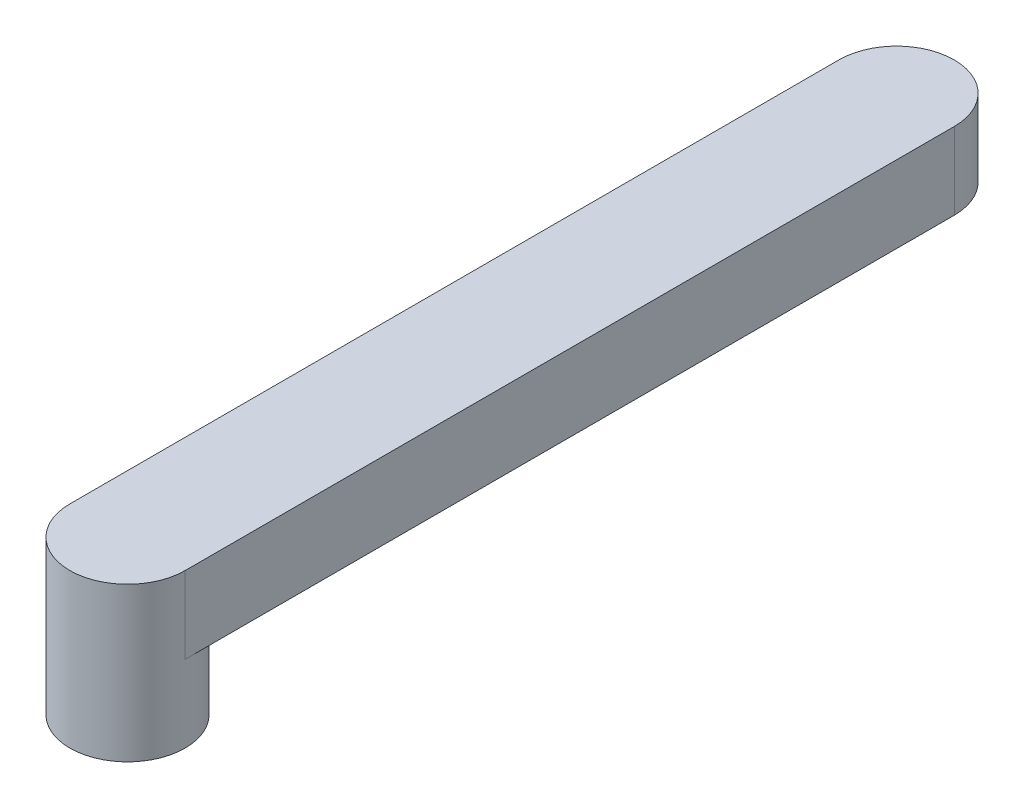
ISO-10303-21;
HEADER;
FILE_DESCRIPTION(('STEP AP214'),'2;1');
FILE_NAME('part.step','',(''),(''),'','','');
FILE_SCHEMA(('AUTOMOTIVE_DESIGN { 1 0 10303 214 1 1 1 1 }'));
ENDSEC;
DATA;
#1=APPLICATION_CONTEXT('core data for automotive mechanical design processes');
#2=APPLICATION_PROTOCOL_DEFINITION('international standard','automotive_design',2000,#1);
#3=PRODUCT_CONTEXT('',#1,'mechanical');
#4=PRODUCT('Part','Part','',(#3));
#5=PRODUCT_RELATED_PRODUCT_CATEGORY('part','',(#4));
#6=PRODUCT_DEFINITION_FORMATION('','',#4);
#7=PRODUCT_DEFINITION_CONTEXT('part definition',#1,'design');
#8=PRODUCT_DEFINITION('design','',#6,#7);
#9=PRODUCT_DEFINITION_SHAPE('','',#8);
#10=(LENGTH_UNIT() NAMED_UNIT(*) SI_UNIT(.MILLI.,.METRE.));
#11=(NAMED_UNIT(*) PLANE_ANGLE_UNIT() SI_UNIT($,.RADIAN.));
#12=(NAMED_UNIT(*) SI_UNIT($,.STERADIAN.) SOLID_ANGLE_UNIT());
#13=UNCERTAINTY_MEASURE_WITH_UNIT(LENGTH_MEASURE(1.E-05),#10,'distance_accuracy_value','');
#14=(GEOMETRIC_REPRESENTATION_CONTEXT(3) GLOBAL_UNCERTAINTY_ASSIGNED_CONTEXT((#13)) GLOBAL_UNIT_ASSIGNED_CONTEXT((#10,
#11,#12)) REPRESENTATION_CONTEXT('',''));
#15=CARTESIAN_POINT('',(0.,0.,0.));
#16=DIRECTION('',(0.,0.,1.));
#17=DIRECTION('',(1.,0.,0.));
#18=AXIS2_PLACEMENT_3D('',#15,#16,#17);
#19=CARTESIAN_POINT('',(1.905,2.54,0.));
#20=DIRECTION('',(-1.,0.,0.));
#21=DIRECTION('',(0.,0.,1.));
#22=AXIS2_PLACEMENT_3D('',#19,#20,#21);
#23=PLANE('',#22);
#24=DIRECTION('',(0.,0.,-1.));
#25=VECTOR('',#24,1.);
#26=CARTESIAN_POINT('',(1.905,0.,0.));
#27=LINE('',#26,#25);
#28=CARTESIAN_POINT('',(1.905,0.,15.24));
#29=VERTEX_POINT('',#28);
#30=CARTESIAN_POINT('',(1.905,0.,-10.16));
#31=VERTEX_POINT('',#30);
#32=EDGE_CURVE('E94',#29,#31,#27,.T.);
#33=ORIENTED_EDGE('',*,*,#32,.T.);
#34=DIRECTION('',(0.,-1.,0.));
#35=VECTOR('',#34,1.);
#36=CARTESIAN_POINT('',(1.905,2.54,-10.16));
#37=LINE('',#36,#35);
#38=CARTESIAN_POINT('',(1.905,2.54,-10.16));
#39=VERTEX_POINT('',#38);
#40=EDGE_CURVE('E11',#39,#31,#37,.T.);
#41=ORIENTED_EDGE('',*,*,#40,.F.);
#42=DIRECTION('',(0.,0.,-1.));
#43=VECTOR('',#42,1.);
#44=CARTESIAN_POINT('',(1.905,2.54,0.));
#45=LINE('',#44,#43);
#46=CARTESIAN_POINT('',(1.905,2.54,15.24));
#47=VERTEX_POINT('',#46);
#48=EDGE_CURVE('E95',#47,#39,#45,.T.);
#49=ORIENTED_EDGE('',*,*,#48,.F.);
#50=DIRECTION('',(0.,-1.,0.));
#51=VECTOR('',#50,1.);
#52=CARTESIAN_POINT('',(1.905,2.54,15.24));
#53=LINE('',#52,#51);
#54=EDGE_CURVE('E83',#47,#29,#53,.T.);
#55=ORIENTED_EDGE('',*,*,#54,.T.);
#56=EDGE_LOOP('',(#33,#41,#49,#55));
#57=FACE_BOUND('',#56,.T.);
#58=ADVANCED_FACE('F39',(#57),#23,.F.);
#59=CARTESIAN_POINT('',(0.,2.54,-10.16));
#60=DIRECTION('',(0.,-1.,0.));
#61=DIRECTION('',(0.,0.,-1.));
#62=AXIS2_PLACEMENT_3D('',#59,#60,#61);
#63=CYLINDRICAL_SURFACE('',#62,1.905);
#64=CARTESIAN_POINT('',(0.,0.,-10.16));
#65=DIRECTION('',(0.,1.,0.));
#66=DIRECTION('',(0.,0.,1.));
#67=AXIS2_PLACEMENT_3D('',#64,#65,#66);
#68=CIRCLE('',#67,1.905);
#69=CARTESIAN_POINT('',(-1.905,0.,-10.16));
#70=VERTEX_POINT('',#69);
#71=EDGE_CURVE('E89',#31,#70,#68,.T.);
#72=ORIENTED_EDGE('',*,*,#71,.T.);
#73=DIRECTION('',(0.,-1.,0.));
#74=VECTOR('',#73,1.);
#75=CARTESIAN_POINT('',(-1.905,2.54,-10.16));
#76=LINE('',#75,#74);
#77=CARTESIAN_POINT('',(-1.905,2.54,-10.16));
#78=VERTEX_POINT('',#77);
#79=EDGE_CURVE('E47',#78,#70,#76,.T.);
#80=ORIENTED_EDGE('',*,*,#79,.F.);
#81=CARTESIAN_POINT('',(0.,2.54,-10.16));
#82=DIRECTION('',(0.,1.,0.));
#83=DIRECTION('',(0.,0.,1.));
#84=AXIS2_PLACEMENT_3D('',#81,#82,#83);
#85=CIRCLE('',#84,1.905);
#86=EDGE_CURVE('E55',#39,#78,#85,.T.);
#87=ORIENTED_EDGE('',*,*,#86,.F.);
#88=ORIENTED_EDGE('',*,*,#40,.T.);
#89=EDGE_LOOP('',(#72,#80,#87,#88));
#90=FACE_BOUND('',#89,.T.);
#91=ADVANCED_FACE('F107',(#90),#63,.T.);
#92=CARTESIAN_POINT('',(-1.905,2.54,0.));
#93=DIRECTION('',(-1.,0.,0.));
#94=DIRECTION('',(0.,0.,1.));
#95=AXIS2_PLACEMENT_3D('',#92,#93,#94);
#96=PLANE('',#95);
#97=DIRECTION('',(0.,0.,-1.));
#98=VECTOR('',#97,1.);
#99=CARTESIAN_POINT('',(-1.905,0.,0.));
#100=LINE('',#99,#98);
#101=CARTESIAN_POINT('',(-1.905,0.,15.24));
#102=VERTEX_POINT('',#101);
#103=EDGE_CURVE('E86',#102,#70,#100,.T.);
#104=ORIENTED_EDGE('',*,*,#103,.F.);
#105=DIRECTION('',(0.,-1.,0.));
#106=VECTOR('',#105,1.);
#107=CARTESIAN_POINT('',(-1.905,2.54,15.24));
#108=LINE('',#107,#106);
#109=CARTESIAN_POINT('',(-1.905,2.54,15.24));
#110=VERTEX_POINT('',#109);
#111=EDGE_CURVE('E74',#110,#102,#108,.T.);
#112=ORIENTED_EDGE('',*,*,#111,.F.);
#113=DIRECTION('',(0.,0.,-1.));
#114=VECTOR('',#113,1.);
#115=CARTESIAN_POINT('',(-1.905,2.54,0.));
#116=LINE('',#115,#114);
#117=EDGE_CURVE('E100',#110,#78,#116,.T.);
#118=ORIENTED_EDGE('',*,*,#117,.T.);
#119=ORIENTED_EDGE('',*,*,#79,.T.);
#120=EDGE_LOOP('',(#104,#112,#118,#119));
#121=FACE_BOUND('',#120,.T.);
#122=ADVANCED_FACE('F87',(#121),#96,.T.);
#123=CARTESIAN_POINT('',(0.,2.54,0.));
#124=DIRECTION('',(0.,1.,0.));
#125=DIRECTION('',(0.,0.,1.));
#126=AXIS2_PLACEMENT_3D('',#123,#124,#125);
#127=PLANE('',#126);
#128=ORIENTED_EDGE('',*,*,#48,.T.);
#129=ORIENTED_EDGE('',*,*,#86,.T.);
#130=ORIENTED_EDGE('',*,*,#117,.F.);
#131=CARTESIAN_POINT('',(0.,2.54,15.24));
#132=DIRECTION('',(0.,1.,0.));
#133=DIRECTION('',(0.,0.,1.));
#134=AXIS2_PLACEMENT_3D('',#131,#132,#133);
#135=CIRCLE('',#134,1.905);
#136=EDGE_CURVE('E82',#110,#47,#135,.T.);
#137=ORIENTED_EDGE('',*,*,#136,.T.);
#138=EDGE_LOOP('',(#128,#129,#130,#137));
#139=FACE_BOUND('',#138,.T.);
#140=ADVANCED_FACE('F116',(#139),#127,.T.);
#141=CARTESIAN_POINT('',(0.,0.,0.));
#142=DIRECTION('',(0.,1.,0.));
#143=DIRECTION('',(0.,0.,1.));
#144=AXIS2_PLACEMENT_3D('',#141,#142,#143);
#145=PLANE('',#144);
#146=ORIENTED_EDGE('',*,*,#32,.F.);
#147=CARTESIAN_POINT('',(0.,0.,15.24));
#148=DIRECTION('',(0.,1.,0.));
#149=DIRECTION('',(0.,0.,1.));
#150=AXIS2_PLACEMENT_3D('',#147,#148,#149);
#151=CIRCLE('',#150,1.905);
#152=EDGE_CURVE('E78',#29,#102,#151,.T.);
#153=ORIENTED_EDGE('',*,*,#152,.T.);
#154=ORIENTED_EDGE('',*,*,#103,.T.);
#155=ORIENTED_EDGE('',*,*,#71,.F.);
#156=EDGE_LOOP('',(#146,#153,#154,#155));
#157=FACE_BOUND('',#156,.T.);
#158=ADVANCED_FACE('F92',(#157),#145,.F.);
#159=CARTESIAN_POINT('',(0.,2.54,15.24));
#160=DIRECTION('',(0.,-1.,0.));
#161=DIRECTION('',(0.,0.,-1.));
#162=AXIS2_PLACEMENT_3D('',#159,#160,#161);
#163=CYLINDRICAL_SURFACE('',#162,1.905);
#164=CARTESIAN_POINT('',(0.,-2.54,15.24));
#165=DIRECTION('',(0.,1.,0.));
#166=DIRECTION('',(0.,0.,1.));
#167=AXIS2_PLACEMENT_3D('',#164,#165,#166);
#168=CIRCLE('',#167,1.905);
#169=CARTESIAN_POINT('',(0.,-2.54,17.145));
#170=VERTEX_POINT('',#169);
#171=EDGE_CURVE('E133',#170,#170,#168,.T.);
#172=ORIENTED_EDGE('',*,*,#171,.T.);
#173=EDGE_LOOP('',(#172));
#174=FACE_BOUND('',#173,.T.);
#175=ORIENTED_EDGE('',*,*,#152,.F.);
#176=ORIENTED_EDGE('',*,*,#54,.F.);
#177=ORIENTED_EDGE('',*,*,#136,.F.);
#178=ORIENTED_EDGE('',*,*,#111,.T.);
#179=EDGE_LOOP('',(#175,#176,#177,#178));
#180=FACE_BOUND('',#179,.T.);
#181=ADVANCED_FACE('F75',(#174,#180),#163,.T.);
#182=CARTESIAN_POINT('',(0.,-2.54,0.));
#183=DIRECTION('',(0.,1.,0.));
#184=DIRECTION('',(0.,0.,1.));
#185=AXIS2_PLACEMENT_3D('',#182,#183,#184);
#186=PLANE('',#185);
#187=ORIENTED_EDGE('',*,*,#171,.F.);
#188=EDGE_LOOP('',(#187));
#189=FACE_BOUND('',#188,.T.);
#190=ADVANCED_FACE('F125',(#189),#186,.F.);
#191=CLOSED_SHELL('',(#58,#91,#122,#140,#158,#181,#190));
#192=MANIFOLD_SOLID_BREP('B2',#191);
#193=ADVANCED_BREP_SHAPE_REPRESENTATION('',(#18,#192),#14);
#194=SHAPE_DEFINITION_REPRESENTATION(#9,#193);
ENDSEC;
END-ISO-10303-21;
